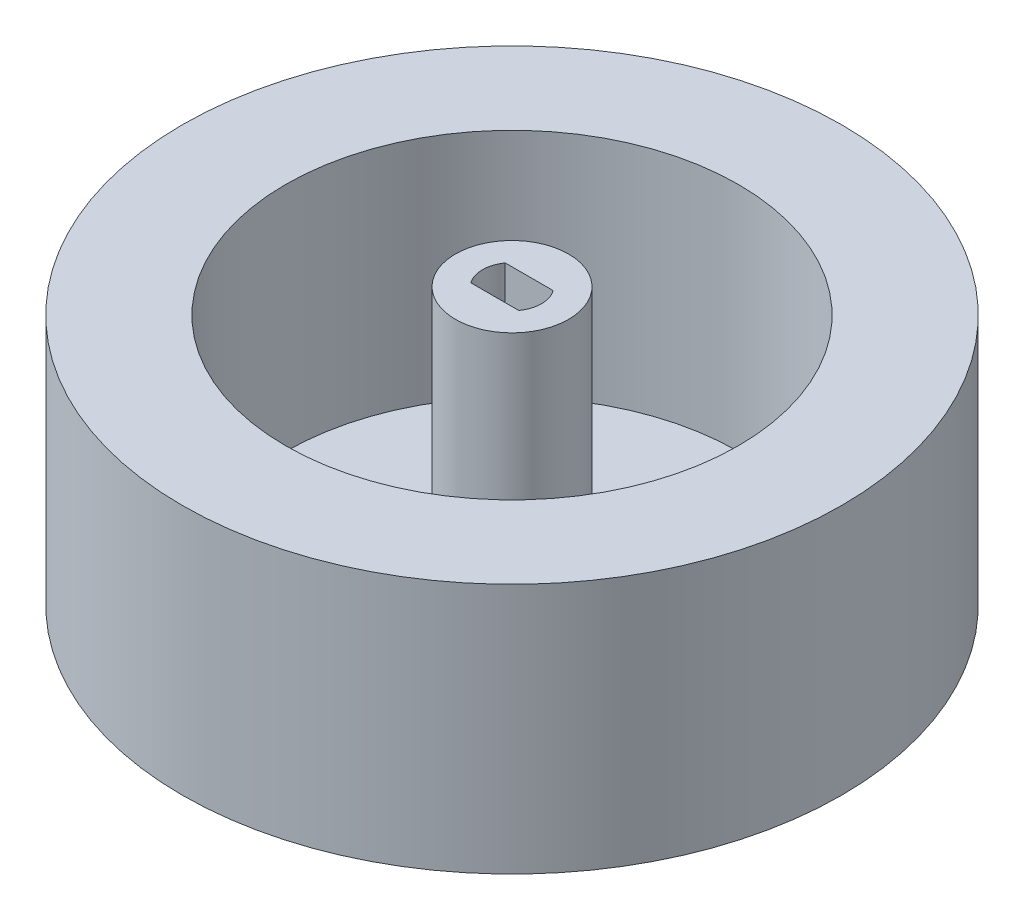
ISO-10303-21;
HEADER;
FILE_DESCRIPTION(('STEP AP214'),'2;1');
FILE_NAME('part.step','',(''),(''),'','','');
FILE_SCHEMA(('AUTOMOTIVE_DESIGN { 1 0 10303 214 1 1 1 1 }'));
ENDSEC;
DATA;
#1=APPLICATION_CONTEXT('core data for automotive mechanical design processes');
#2=APPLICATION_PROTOCOL_DEFINITION('international standard','automotive_design',2000,#1);
#3=PRODUCT_CONTEXT('',#1,'mechanical');
#4=PRODUCT('Part','Part','',(#3));
#5=PRODUCT_RELATED_PRODUCT_CATEGORY('part','',(#4));
#6=PRODUCT_DEFINITION_FORMATION('','',#4);
#7=PRODUCT_DEFINITION_CONTEXT('part definition',#1,'design');
#8=PRODUCT_DEFINITION('design','',#6,#7);
#9=PRODUCT_DEFINITION_SHAPE('','',#8);
#10=(LENGTH_UNIT() NAMED_UNIT(*) SI_UNIT(.MILLI.,.METRE.));
#11=(NAMED_UNIT(*) PLANE_ANGLE_UNIT() SI_UNIT($,.RADIAN.));
#12=(NAMED_UNIT(*) SI_UNIT($,.STERADIAN.) SOLID_ANGLE_UNIT());
#13=UNCERTAINTY_MEASURE_WITH_UNIT(LENGTH_MEASURE(1.E-05),#10,'distance_accuracy_value','');
#14=(GEOMETRIC_REPRESENTATION_CONTEXT(3) GLOBAL_UNCERTAINTY_ASSIGNED_CONTEXT((#13)) GLOBAL_UNIT_ASSIGNED_CONTEXT((#10,
#11,#12)) REPRESENTATION_CONTEXT('',''));
#15=CARTESIAN_POINT('',(0.,0.,0.));
#16=DIRECTION('',(0.,0.,1.));
#17=DIRECTION('',(1.,0.,0.));
#18=AXIS2_PLACEMENT_3D('',#15,#16,#17);
#19=CARTESIAN_POINT('',(0.,25.5,0.));
#20=DIRECTION('',(0.,-1.,0.));
#21=DIRECTION('',(0.,0.,-1.));
#22=AXIS2_PLACEMENT_3D('',#19,#20,#21);
#23=CYLINDRICAL_SURFACE('',#22,33.5);
#24=CARTESIAN_POINT('',(0.,25.5,0.));
#25=DIRECTION('',(0.,1.,0.));
#26=DIRECTION('',(0.,0.,1.));
#27=AXIS2_PLACEMENT_3D('',#24,#25,#26);
#28=CIRCLE('',#27,33.5);
#29=CARTESIAN_POINT('',(0.,25.5,33.5));
#30=VERTEX_POINT('',#29);
#31=EDGE_CURVE('E11',#30,#30,#28,.T.);
#32=ORIENTED_EDGE('',*,*,#31,.F.);
#33=EDGE_LOOP('',(#32));
#34=FACE_BOUND('',#33,.T.);
#35=CARTESIAN_POINT('',(0.,0.,0.));
#36=DIRECTION('',(0.,1.,0.));
#37=DIRECTION('',(0.,0.,1.));
#38=AXIS2_PLACEMENT_3D('',#35,#36,#37);
#39=CIRCLE('',#38,33.5);
#40=CARTESIAN_POINT('',(0.,0.,33.5));
#41=VERTEX_POINT('',#40);
#42=EDGE_CURVE('E36',#41,#41,#39,.T.);
#43=ORIENTED_EDGE('',*,*,#42,.T.);
#44=EDGE_LOOP('',(#43));
#45=FACE_BOUND('',#44,.T.);
#46=ADVANCED_FACE('F33',(#34,#45),#23,.T.);
#47=CARTESIAN_POINT('',(0.,25.5,0.));
#48=DIRECTION('',(0.,1.,0.));
#49=DIRECTION('',(0.,0.,1.));
#50=AXIS2_PLACEMENT_3D('',#47,#48,#49);
#51=PLANE('',#50);
#52=CARTESIAN_POINT('',(0.,25.5,0.));
#53=DIRECTION('',(0.,1.,0.));
#54=DIRECTION('',(0.,0.,1.));
#55=AXIS2_PLACEMENT_3D('',#52,#53,#54);
#56=CIRCLE('',#55,23.);
#57=CARTESIAN_POINT('',(0.,25.5,23.));
#58=VERTEX_POINT('',#57);
#59=EDGE_CURVE('E106',#58,#58,#56,.T.);
#60=ORIENTED_EDGE('',*,*,#59,.F.);
#61=EDGE_LOOP('',(#60));
#62=FACE_BOUND('',#61,.T.);
#63=ORIENTED_EDGE('',*,*,#31,.T.);
#64=EDGE_LOOP('',(#63));
#65=FACE_BOUND('',#64,.T.);
#66=ADVANCED_FACE('F118',(#62,#65),#51,.T.);
#67=CARTESIAN_POINT('',(0.,0.,0.));
#68=DIRECTION('',(0.,1.,0.));
#69=DIRECTION('',(0.,0.,1.));
#70=AXIS2_PLACEMENT_3D('',#67,#68,#69);
#71=PLANE('',#70);
#72=ORIENTED_EDGE('',*,*,#42,.F.);
#73=EDGE_LOOP('',(#72));
#74=FACE_BOUND('',#73,.T.);
#75=ADVANCED_FACE('F121',(#74),#71,.F.);
#76=CARTESIAN_POINT('',(0.,2.,0.));
#77=DIRECTION('',(0.,1.,0.));
#78=DIRECTION('',(0.,0.,1.));
#79=AXIS2_PLACEMENT_3D('',#76,#77,#78);
#80=CYLINDRICAL_SURFACE('',#79,23.);
#81=CARTESIAN_POINT('',(0.,2.,0.));
#82=DIRECTION('',(0.,1.,0.));
#83=DIRECTION('',(0.,0.,1.));
#84=AXIS2_PLACEMENT_3D('',#81,#82,#83);
#85=CIRCLE('',#84,23.);
#86=CARTESIAN_POINT('',(0.,2.,23.));
#87=VERTEX_POINT('',#86);
#88=EDGE_CURVE('E110',#87,#87,#85,.T.);
#89=ORIENTED_EDGE('',*,*,#88,.F.);
#90=EDGE_LOOP('',(#89));
#91=FACE_BOUND('',#90,.T.);
#92=ORIENTED_EDGE('',*,*,#59,.T.);
#93=EDGE_LOOP('',(#92));
#94=FACE_BOUND('',#93,.T.);
#95=ADVANCED_FACE('F116',(#91,#94),#80,.F.);
#96=CARTESIAN_POINT('',(0.,2.,0.));
#97=DIRECTION('',(0.,1.,0.));
#98=DIRECTION('',(0.,0.,1.));
#99=AXIS2_PLACEMENT_3D('',#96,#97,#98);
#100=PLANE('',#99);
#101=CARTESIAN_POINT('',(0.,2.,0.));
#102=DIRECTION('',(0.,1.,0.));
#103=DIRECTION('',(0.,0.,1.));
#104=AXIS2_PLACEMENT_3D('',#101,#102,#103);
#105=CIRCLE('',#104,5.75);
#106=CARTESIAN_POINT('',(0.,2.,-5.75));
#107=VERTEX_POINT('',#106);
#108=EDGE_CURVE('E107',#107,#107,#105,.T.);
#109=ORIENTED_EDGE('',*,*,#108,.F.);
#110=EDGE_LOOP('',(#109));
#111=FACE_BOUND('',#110,.T.);
#112=ORIENTED_EDGE('',*,*,#88,.T.);
#113=EDGE_LOOP('',(#112));
#114=FACE_BOUND('',#113,.T.);
#115=ADVANCED_FACE('F134',(#111,#114),#100,.T.);
#116=CARTESIAN_POINT('',(0.,28.,0.));
#117=DIRECTION('',(0.,-1.,0.));
#118=DIRECTION('',(0.,0.,-1.));
#119=AXIS2_PLACEMENT_3D('',#116,#117,#118);
#120=CYLINDRICAL_SURFACE('',#119,5.75);
#121=CARTESIAN_POINT('',(0.,28.,0.));
#122=DIRECTION('',(0.,1.,0.));
#123=DIRECTION('',(0.,0.,1.));
#124=AXIS2_PLACEMENT_3D('',#121,#122,#123);
#125=CIRCLE('',#124,5.75);
#126=CARTESIAN_POINT('',(0.,28.,-5.75));
#127=VERTEX_POINT('',#126);
#128=EDGE_CURVE('E103',#127,#127,#125,.T.);
#129=CARTESIAN_POINT('',(0.,28.,-5.75));
#130=CARTESIAN_POINT('',(0.,27.7291666666667,-5.75));
#131=CARTESIAN_POINT('',(0.,27.4583333333333,-5.75));
#132=CARTESIAN_POINT('',(0.,26.9166666666667,-5.75));
#133=CARTESIAN_POINT('',(0.,26.6458333333333,-5.75));
#134=CARTESIAN_POINT('',(0.,26.1041666666667,-5.75));
#135=CARTESIAN_POINT('',(0.,25.8333333333333,-5.75));
#136=CARTESIAN_POINT('',(0.,25.2916666666667,-5.75));
#137=CARTESIAN_POINT('',(0.,25.0208333333333,-5.75));
#138=CARTESIAN_POINT('',(0.,24.4791666666667,-5.75));
#139=CARTESIAN_POINT('',(0.,24.2083333333333,-5.75));
#140=CARTESIAN_POINT('',(0.,23.6666666666667,-5.75));
#141=CARTESIAN_POINT('',(0.,23.3958333333333,-5.75));
#142=CARTESIAN_POINT('',(0.,22.8541666666667,-5.75));
#143=CARTESIAN_POINT('',(0.,22.5833333333333,-5.75));
#144=CARTESIAN_POINT('',(0.,22.0416666666667,-5.75));
#145=CARTESIAN_POINT('',(0.,21.7708333333333,-5.75));
#146=CARTESIAN_POINT('',(0.,21.2291666666667,-5.75));
#147=CARTESIAN_POINT('',(0.,20.9583333333333,-5.75));
#148=CARTESIAN_POINT('',(0.,20.4166666666667,-5.75));
#149=CARTESIAN_POINT('',(0.,20.1458333333333,-5.75));
#150=CARTESIAN_POINT('',(0.,19.6041666666667,-5.75));
#151=CARTESIAN_POINT('',(0.,19.3333333333333,-5.75));
#152=CARTESIAN_POINT('',(0.,18.7916666666667,-5.75));
#153=CARTESIAN_POINT('',(0.,18.5208333333333,-5.75));
#154=CARTESIAN_POINT('',(0.,17.9791666666667,-5.75));
#155=CARTESIAN_POINT('',(0.,17.7083333333333,-5.75));
#156=CARTESIAN_POINT('',(0.,17.1666666666667,-5.75));
#157=CARTESIAN_POINT('',(0.,16.8958333333333,-5.75));
#158=CARTESIAN_POINT('',(0.,16.3541666666667,-5.75));
#159=CARTESIAN_POINT('',(0.,16.0833333333333,-5.75));
#160=CARTESIAN_POINT('',(0.,15.5416666666667,-5.75));
#161=CARTESIAN_POINT('',(0.,15.2708333333333,-5.75));
#162=CARTESIAN_POINT('',(0.,14.7291666666667,-5.75));
#163=CARTESIAN_POINT('',(0.,14.4583333333333,-5.75));
#164=CARTESIAN_POINT('',(0.,13.9166666666667,-5.75));
#165=CARTESIAN_POINT('',(0.,13.6458333333333,-5.75));
#166=CARTESIAN_POINT('',(0.,13.1041666666667,-5.75));
#167=CARTESIAN_POINT('',(0.,12.8333333333333,-5.75));
#168=CARTESIAN_POINT('',(0.,12.2916666666667,-5.75));
#169=CARTESIAN_POINT('',(0.,12.0208333333333,-5.75));
#170=CARTESIAN_POINT('',(0.,11.4791666666667,-5.75));
#171=CARTESIAN_POINT('',(0.,11.2083333333333,-5.75));
#172=CARTESIAN_POINT('',(0.,10.6666666666667,-5.75));
#173=CARTESIAN_POINT('',(0.,10.3958333333333,-5.75));
#174=CARTESIAN_POINT('',(0.,9.85416666666667,-5.75));
#175=CARTESIAN_POINT('',(0.,9.58333333333333,-5.75));
#176=CARTESIAN_POINT('',(0.,9.04166666666666,-5.75));
#177=CARTESIAN_POINT('',(0.,8.77083333333333,-5.75));
#178=CARTESIAN_POINT('',(0.,8.22916666666666,-5.75));
#179=CARTESIAN_POINT('',(0.,7.95833333333333,-5.75));
#180=CARTESIAN_POINT('',(0.,7.41666666666667,-5.75));
#181=CARTESIAN_POINT('',(0.,7.14583333333333,-5.75));
#182=CARTESIAN_POINT('',(0.,6.60416666666667,-5.75));
#183=CARTESIAN_POINT('',(0.,6.33333333333333,-5.75));
#184=CARTESIAN_POINT('',(0.,5.79166666666666,-5.75));
#185=CARTESIAN_POINT('',(0.,5.52083333333333,-5.75));
#186=CARTESIAN_POINT('',(0.,4.97916666666666,-5.75));
#187=CARTESIAN_POINT('',(0.,4.70833333333333,-5.75));
#188=CARTESIAN_POINT('',(0.,4.16666666666667,-5.75));
#189=CARTESIAN_POINT('',(0.,3.89583333333333,-5.75));
#190=CARTESIAN_POINT('',(0.,3.35416666666667,-5.75));
#191=CARTESIAN_POINT('',(0.,3.08333333333333,-5.75));
#192=CARTESIAN_POINT('',(0.,2.54166666666667,-5.75));
#193=CARTESIAN_POINT('',(0.,2.27083333333333,-5.75));
#194=CARTESIAN_POINT('',(0.,2.,-5.75));
#195=B_SPLINE_CURVE_WITH_KNOTS('',3,(#129,#130,#131,#132,#133,#134,#135,#136,#137,#138,#139,
#140,#141,#142,#143,#144,#145,#146,#147,#148,#149,#150,#151,#152,#153,#154,#155,#156,#157,#158,
#159,#160,#161,#162,#163,#164,#165,#166,#167,#168,#169,#170,#171,#172,#173,#174,#175,#176,#177,
#178,#179,#180,#181,#182,#183,#184,#185,#186,#187,#188,#189,#190,#191,#192,#193,#194),
.UNSPECIFIED.,.F.,.F.,(4,2,2,2,2,2,2,2,2,2,2,2,2,2,2,2,2,2,2,2,2,2,2,2,2,2,2,2,2,2,2,2,4),(0.,
0.812500000000001,1.625,2.4375,3.25,4.0625,4.875,5.6875,6.5,7.3125,8.125,8.9375,9.75,10.5625,
11.375,12.1875,13.,13.8125,14.625,15.4375,16.25,17.0625,17.875,18.6875,19.5,20.3125,21.125,
21.9375,22.75,23.5625,24.375,25.1875,26.),.UNSPECIFIED.);
#196=EDGE_CURVE('BSEAM140',#127,#107,#195,.T.);
#197=ORIENTED_EDGE('',*,*,#128,.F.);
#198=ORIENTED_EDGE('',*,*,#108,.T.);
#199=ORIENTED_EDGE('',*,*,#196,.T.);
#200=ORIENTED_EDGE('',*,*,#196,.F.);
#201=EDGE_LOOP('',(#197,#199,#198,#200));
#202=FACE_BOUND('',#201,.T.);
#203=ADVANCED_FACE('F140',(#202),#120,.T.);
#204=CARTESIAN_POINT('',(0.,28.,0.));
#205=DIRECTION('',(0.,1.,0.));
#206=DIRECTION('',(0.,0.,1.));
#207=AXIS2_PLACEMENT_3D('',#204,#205,#206);
#208=PLANE('',#207);
#209=DIRECTION('',(1.,0.,0.));
#210=VECTOR('',#209,1.);
#211=CARTESIAN_POINT('',(0.,28.,1.75));
#212=LINE('',#211,#210);
#213=CARTESIAN_POINT('',(-2.43669858620224,28.,1.75));
#214=VERTEX_POINT('',#213);
#215=CARTESIAN_POINT('',(2.43669858620224,28.,1.75));
#216=VERTEX_POINT('',#215);
#217=EDGE_CURVE('E47',#214,#216,#212,.T.);
#218=ORIENTED_EDGE('',*,*,#217,.F.);
#219=CARTESIAN_POINT('',(0.,28.,0.));
#220=DIRECTION('',(0.,1.,0.));
#221=DIRECTION('',(0.,0.,1.));
#222=AXIS2_PLACEMENT_3D('',#219,#220,#221);
#223=CIRCLE('',#222,3.);
#224=CARTESIAN_POINT('',(-2.43669858620224,28.,-1.75));
#225=VERTEX_POINT('',#224);
#226=EDGE_CURVE('E98',#225,#214,#223,.T.);
#227=ORIENTED_EDGE('',*,*,#226,.F.);
#228=DIRECTION('',(1.,0.,0.));
#229=VECTOR('',#228,1.);
#230=CARTESIAN_POINT('',(0.,28.,-1.75));
#231=LINE('',#230,#229);
#232=CARTESIAN_POINT('',(2.43669858620224,28.,-1.75));
#233=VERTEX_POINT('',#232);
#234=EDGE_CURVE('E230',#225,#233,#231,.T.);
#235=ORIENTED_EDGE('',*,*,#234,.T.);
#236=EDGE_CURVE('E92',#216,#233,#223,.T.);
#237=ORIENTED_EDGE('',*,*,#236,.F.);
#238=EDGE_LOOP('',(#218,#227,#235,#237));
#239=FACE_BOUND('',#238,.T.);
#240=ORIENTED_EDGE('',*,*,#128,.T.);
#241=EDGE_LOOP('',(#240));
#242=FACE_BOUND('',#241,.T.);
#243=ADVANCED_FACE('F144',(#239,#242),#208,.T.);
#244=CARTESIAN_POINT('',(0.,8.,1.75));
#245=DIRECTION('',(0.,0.,1.));
#246=DIRECTION('',(1.,0.,0.));
#247=AXIS2_PLACEMENT_3D('',#244,#245,#246);
#248=PLANE('',#247);
#249=ORIENTED_EDGE('',*,*,#217,.T.);
#250=DIRECTION('',(0.,1.,0.));
#251=VECTOR('',#250,1.);
#252=CARTESIAN_POINT('',(2.43669858620224,8.,1.75));
#253=LINE('',#252,#251);
#254=CARTESIAN_POINT('',(2.43669858620224,8.,1.75));
#255=VERTEX_POINT('',#254);
#256=EDGE_CURVE('E70',#255,#216,#253,.T.);
#257=ORIENTED_EDGE('',*,*,#256,.F.);
#258=DIRECTION('',(1.,0.,0.));
#259=VECTOR('',#258,1.);
#260=CARTESIAN_POINT('',(0.,8.,1.75));
#261=LINE('',#260,#259);
#262=CARTESIAN_POINT('',(-2.43669858620224,8.,1.75));
#263=VERTEX_POINT('',#262);
#264=EDGE_CURVE('E96',#263,#255,#261,.T.);
#265=ORIENTED_EDGE('',*,*,#264,.F.);
#266=DIRECTION('',(0.,1.,0.));
#267=VECTOR('',#266,1.);
#268=CARTESIAN_POINT('',(-2.43669858620224,8.,1.75));
#269=LINE('',#268,#267);
#270=EDGE_CURVE('E55',#263,#214,#269,.T.);
#271=ORIENTED_EDGE('',*,*,#270,.T.);
#272=EDGE_LOOP('',(#249,#257,#265,#271));
#273=FACE_BOUND('',#272,.T.);
#274=ADVANCED_FACE('F148',(#273),#248,.F.);
#275=CARTESIAN_POINT('',(0.,8.,0.));
#276=DIRECTION('',(0.,1.,0.));
#277=DIRECTION('',(0.,0.,1.));
#278=AXIS2_PLACEMENT_3D('',#275,#276,#277);
#279=CYLINDRICAL_SURFACE('',#278,3.);
#280=ORIENTED_EDGE('',*,*,#226,.T.);
#281=ORIENTED_EDGE('',*,*,#270,.F.);
#282=CARTESIAN_POINT('',(0.,8.,0.));
#283=DIRECTION('',(0.,1.,0.));
#284=DIRECTION('',(0.,0.,1.));
#285=AXIS2_PLACEMENT_3D('',#282,#283,#284);
#286=CIRCLE('',#285,3.);
#287=CARTESIAN_POINT('',(-2.43669858620224,8.,-1.75));
#288=VERTEX_POINT('',#287);
#289=EDGE_CURVE('E85',#288,#263,#286,.T.);
#290=ORIENTED_EDGE('',*,*,#289,.F.);
#291=DIRECTION('',(0.,1.,0.));
#292=VECTOR('',#291,1.);
#293=CARTESIAN_POINT('',(-2.43669858620224,8.,-1.75));
#294=LINE('',#293,#292);
#295=EDGE_CURVE('E81',#288,#225,#294,.T.);
#296=ORIENTED_EDGE('',*,*,#295,.T.);
#297=EDGE_LOOP('',(#280,#281,#290,#296));
#298=FACE_BOUND('',#297,.T.);
#299=ADVANCED_FACE('F152',(#298),#279,.F.);
#300=CARTESIAN_POINT('',(0.,8.,-1.75));
#301=DIRECTION('',(0.,0.,1.));
#302=DIRECTION('',(1.,0.,0.));
#303=AXIS2_PLACEMENT_3D('',#300,#301,#302);
#304=PLANE('',#303);
#305=ORIENTED_EDGE('',*,*,#234,.F.);
#306=ORIENTED_EDGE('',*,*,#295,.F.);
#307=DIRECTION('',(1.,0.,0.));
#308=VECTOR('',#307,1.);
#309=CARTESIAN_POINT('',(0.,8.,-1.75));
#310=LINE('',#309,#308);
#311=CARTESIAN_POINT('',(2.43669858620224,8.,-1.75));
#312=VERTEX_POINT('',#311);
#313=EDGE_CURVE('E75',#288,#312,#310,.T.);
#314=ORIENTED_EDGE('',*,*,#313,.T.);
#315=DIRECTION('',(0.,1.,0.));
#316=VECTOR('',#315,1.);
#317=CARTESIAN_POINT('',(2.43669858620224,8.,-1.75));
#318=LINE('',#317,#316);
#319=EDGE_CURVE('E79',#312,#233,#318,.T.);
#320=ORIENTED_EDGE('',*,*,#319,.T.);
#321=EDGE_LOOP('',(#305,#306,#314,#320));
#322=FACE_BOUND('',#321,.T.);
#323=ADVANCED_FACE('F78',(#322),#304,.T.);
#324=ORIENTED_EDGE('',*,*,#236,.T.);
#325=ORIENTED_EDGE('',*,*,#319,.F.);
#326=EDGE_CURVE('E86',#255,#312,#286,.T.);
#327=ORIENTED_EDGE('',*,*,#326,.F.);
#328=ORIENTED_EDGE('',*,*,#256,.T.);
#329=EDGE_LOOP('',(#324,#325,#327,#328));
#330=FACE_BOUND('',#329,.T.);
#331=ADVANCED_FACE('F89',(#330),#279,.F.);
#332=CARTESIAN_POINT('',(0.,8.,0.));
#333=DIRECTION('',(0.,1.,0.));
#334=DIRECTION('',(0.,0.,1.));
#335=AXIS2_PLACEMENT_3D('',#332,#333,#334);
#336=PLANE('',#335);
#337=ORIENTED_EDGE('',*,*,#264,.T.);
#338=ORIENTED_EDGE('',*,*,#326,.T.);
#339=ORIENTED_EDGE('',*,*,#313,.F.);
#340=ORIENTED_EDGE('',*,*,#289,.T.);
#341=EDGE_LOOP('',(#337,#338,#339,#340));
#342=FACE_BOUND('',#341,.T.);
#343=ADVANCED_FACE('F95',(#342),#336,.T.);
#344=CLOSED_SHELL('',(#46,#66,#75,#95,#115,#203,#243,#274,#299,#323,#331,#343));
#345=MANIFOLD_SOLID_BREP('B2',#344);
#346=ADVANCED_BREP_SHAPE_REPRESENTATION('',(#18,#345),#14);
#347=SHAPE_DEFINITION_REPRESENTATION(#9,#346);
ENDSEC;
END-ISO-10303-21;
